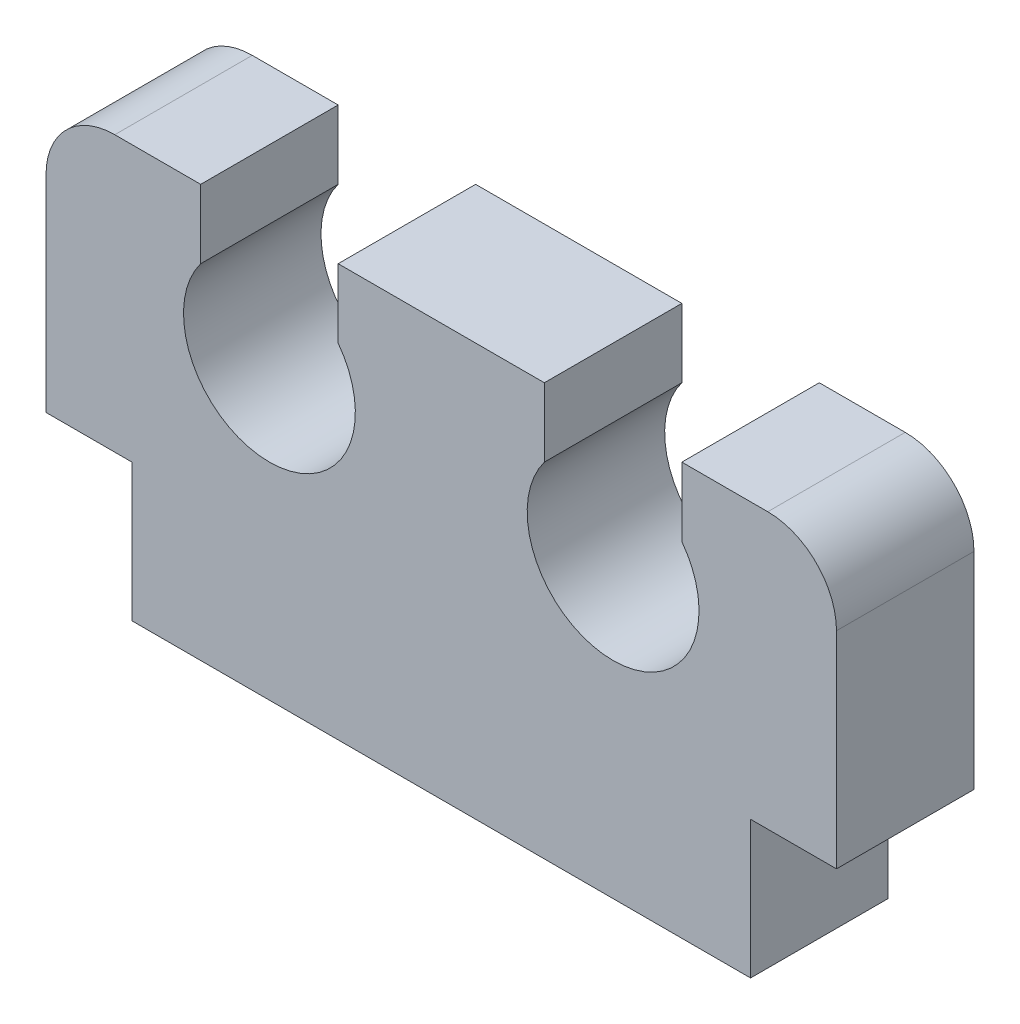
ISO-10303-21;
HEADER;
FILE_DESCRIPTION(('STEP AP214'),'2;1');
FILE_NAME('part.step','',(''),(''),'','','');
FILE_SCHEMA(('AUTOMOTIVE_DESIGN { 1 0 10303 214 1 1 1 1 }'));
ENDSEC;
DATA;
#1=APPLICATION_CONTEXT('core data for automotive mechanical design processes');
#2=APPLICATION_PROTOCOL_DEFINITION('international standard','automotive_design',2000,#1);
#3=PRODUCT_CONTEXT('',#1,'mechanical');
#4=PRODUCT('Part','Part','',(#3));
#5=PRODUCT_RELATED_PRODUCT_CATEGORY('part','',(#4));
#6=PRODUCT_DEFINITION_FORMATION('','',#4);
#7=PRODUCT_DEFINITION_CONTEXT('part definition',#1,'design');
#8=PRODUCT_DEFINITION('design','',#6,#7);
#9=PRODUCT_DEFINITION_SHAPE('','',#8);
#10=(LENGTH_UNIT() NAMED_UNIT(*) SI_UNIT(.MILLI.,.METRE.));
#11=(NAMED_UNIT(*) PLANE_ANGLE_UNIT() SI_UNIT($,.RADIAN.));
#12=(NAMED_UNIT(*) SI_UNIT($,.STERADIAN.) SOLID_ANGLE_UNIT());
#13=UNCERTAINTY_MEASURE_WITH_UNIT(LENGTH_MEASURE(1.E-05),#10,'distance_accuracy_value','');
#14=(GEOMETRIC_REPRESENTATION_CONTEXT(3) GLOBAL_UNCERTAINTY_ASSIGNED_CONTEXT((#13)) GLOBAL_UNIT_ASSIGNED_CONTEXT((#10,
#11,#12)) REPRESENTATION_CONTEXT('',''));
#15=CARTESIAN_POINT('',(0.,0.,0.));
#16=DIRECTION('',(0.,0.,1.));
#17=DIRECTION('',(1.,0.,0.));
#18=AXIS2_PLACEMENT_3D('',#15,#16,#17);
#19=CARTESIAN_POINT('',(1972.60984128656,1159.14364122188,2.));
#20=DIRECTION('',(0.,0.,-1.));
#21=DIRECTION('',(-1.,0.,0.));
#22=AXIS2_PLACEMENT_3D('',#19,#20,#21);
#23=CYLINDRICAL_SURFACE('',#22,1.24999999999988);
#24=CARTESIAN_POINT('',(1972.60984128656,1159.14364122188,0.));
#25=DIRECTION('',(0.,0.,-1.));
#26=DIRECTION('',(1.,0.,0.));
#27=AXIS2_PLACEMENT_3D('',#24,#25,#26);
#28=CIRCLE('',#27,1.24999999999988);
#29=CARTESIAN_POINT('',(1973.60984128656,1159.89364122188,0.));
#30=VERTEX_POINT('',#29);
#31=CARTESIAN_POINT('',(1971.60984128656,1159.89364122188,0.));
#32=VERTEX_POINT('',#31);
#33=EDGE_CURVE('E190',#30,#32,#28,.T.);
#34=ORIENTED_EDGE('',*,*,#33,.T.);
#35=DIRECTION('',(0.,0.,-1.));
#36=VECTOR('',#35,1.);
#37=CARTESIAN_POINT('',(1971.60984128656,1159.89364122188,2.));
#38=LINE('',#37,#36);
#39=CARTESIAN_POINT('',(1971.60984128656,1159.89364122188,2.));
#40=VERTEX_POINT('',#39);
#41=EDGE_CURVE('E11',#40,#32,#38,.T.);
#42=ORIENTED_EDGE('',*,*,#41,.F.);
#43=CARTESIAN_POINT('',(1972.60984128656,1159.14364122188,2.));
#44=DIRECTION('',(0.,0.,-1.));
#45=DIRECTION('',(1.,0.,0.));
#46=AXIS2_PLACEMENT_3D('',#43,#44,#45);
#47=CIRCLE('',#46,1.24999999999988);
#48=CARTESIAN_POINT('',(1973.60984128656,1159.89364122188,2.));
#49=VERTEX_POINT('',#48);
#50=EDGE_CURVE('E224',#49,#40,#47,.T.);
#51=ORIENTED_EDGE('',*,*,#50,.F.);
#52=DIRECTION('',(0.,0.,-1.));
#53=VECTOR('',#52,1.);
#54=CARTESIAN_POINT('',(1973.60984128656,1159.89364122188,2.));
#55=LINE('',#54,#53);
#56=EDGE_CURVE('E186',#49,#30,#55,.T.);
#57=ORIENTED_EDGE('',*,*,#56,.T.);
#58=EDGE_LOOP('',(#34,#42,#51,#57));
#59=FACE_BOUND('',#58,.T.);
#60=ADVANCED_FACE('F34',(#59),#23,.F.);
#61=CARTESIAN_POINT('',(1971.60984128656,1160.89364122188,2.));
#62=DIRECTION('',(-1.,2.22044604924908E-13,0.));
#63=DIRECTION('',(-2.22044604924908E-13,-1.,0.));
#64=AXIS2_PLACEMENT_3D('',#61,#62,#63);
#65=PLANE('',#64);
#66=DIRECTION('',(2.22044604924908E-13,1.,0.));
#67=VECTOR('',#66,1.);
#68=CARTESIAN_POINT('',(1971.60984128656,1160.89364122188,0.));
#69=LINE('',#68,#67);
#70=CARTESIAN_POINT('',(1971.60984128656,1160.89364122188,0.));
#71=VERTEX_POINT('',#70);
#72=EDGE_CURVE('E193',#32,#71,#69,.T.);
#73=ORIENTED_EDGE('',*,*,#72,.T.);
#74=DIRECTION('',(0.,0.,-1.));
#75=VECTOR('',#74,1.);
#76=CARTESIAN_POINT('',(1971.60984128656,1160.89364122188,2.));
#77=LINE('',#76,#75);
#78=CARTESIAN_POINT('',(1971.60984128656,1160.89364122188,2.));
#79=VERTEX_POINT('',#78);
#80=EDGE_CURVE('E42',#79,#71,#77,.T.);
#81=ORIENTED_EDGE('',*,*,#80,.F.);
#82=DIRECTION('',(2.22044604924908E-13,1.,0.));
#83=VECTOR('',#82,1.);
#84=CARTESIAN_POINT('',(1971.60984128656,1160.89364122188,2.));
#85=LINE('',#84,#83);
#86=EDGE_CURVE('E123',#40,#79,#85,.T.);
#87=ORIENTED_EDGE('',*,*,#86,.F.);
#88=ORIENTED_EDGE('',*,*,#41,.T.);
#89=EDGE_LOOP('',(#73,#81,#87,#88));
#90=FACE_BOUND('',#89,.T.);
#91=ADVANCED_FACE('F332',(#90),#65,.F.);
#92=CARTESIAN_POINT('',(1971.60984128656,1160.89364122188,2.));
#93=DIRECTION('',(-8.88178419700933E-13,-1.,0.));
#94=DIRECTION('',(1.,-8.88178419700933E-13,0.));
#95=AXIS2_PLACEMENT_3D('',#92,#93,#94);
#96=PLANE('',#95);
#97=DIRECTION('',(-1.,8.88178419700933E-13,0.));
#98=VECTOR('',#97,1.);
#99=CARTESIAN_POINT('',(1971.60984128656,1160.89364122188,0.));
#100=LINE('',#99,#98);
#101=CARTESIAN_POINT('',(1970.35984128656,1160.89364122188,0.));
#102=VERTEX_POINT('',#101);
#103=EDGE_CURVE('E195',#71,#102,#100,.T.);
#104=ORIENTED_EDGE('',*,*,#103,.T.);
#105=DIRECTION('',(0.,0.,-1.));
#106=VECTOR('',#105,1.);
#107=CARTESIAN_POINT('',(1970.35984128656,1160.89364122188,2.));
#108=LINE('',#107,#106);
#109=CARTESIAN_POINT('',(1970.35984128656,1160.89364122188,2.));
#110=VERTEX_POINT('',#109);
#111=EDGE_CURVE('E261',#110,#102,#108,.T.);
#112=ORIENTED_EDGE('',*,*,#111,.F.);
#113=DIRECTION('',(-1.,8.88178419700933E-13,0.));
#114=VECTOR('',#113,1.);
#115=CARTESIAN_POINT('',(1971.60984128656,1160.89364122188,2.));
#116=LINE('',#115,#114);
#117=EDGE_CURVE('E269',#79,#110,#116,.T.);
#118=ORIENTED_EDGE('',*,*,#117,.F.);
#119=ORIENTED_EDGE('',*,*,#80,.T.);
#120=EDGE_LOOP('',(#104,#112,#118,#119));
#121=FACE_BOUND('',#120,.T.);
#122=ADVANCED_FACE('F267',(#121),#96,.F.);
#123=CARTESIAN_POINT('',(1970.35984128656,1159.89364122188,2.));
#124=DIRECTION('',(0.,0.,-1.));
#125=DIRECTION('',(-1.,0.,0.));
#126=AXIS2_PLACEMENT_3D('',#123,#124,#125);
#127=CYLINDRICAL_SURFACE('',#126,0.99999999999989);
#128=CARTESIAN_POINT('',(1970.35984128656,1159.89364122188,0.));
#129=DIRECTION('',(0.,0.,1.));
#130=DIRECTION('',(1.,0.,0.));
#131=AXIS2_PLACEMENT_3D('',#128,#129,#130);
#132=CIRCLE('',#131,0.99999999999989);
#133=CARTESIAN_POINT('',(1969.35984128656,1159.89364122188,0.));
#134=VERTEX_POINT('',#133);
#135=EDGE_CURVE('E197',#102,#134,#132,.T.);
#136=ORIENTED_EDGE('',*,*,#135,.T.);
#137=DIRECTION('',(0.,0.,-1.));
#138=VECTOR('',#137,1.);
#139=CARTESIAN_POINT('',(1969.35984128656,1159.89364122188,2.));
#140=LINE('',#139,#138);
#141=CARTESIAN_POINT('',(1969.35984128656,1159.89364122188,2.));
#142=VERTEX_POINT('',#141);
#143=EDGE_CURVE('E258',#142,#134,#140,.T.);
#144=ORIENTED_EDGE('',*,*,#143,.F.);
#145=CARTESIAN_POINT('',(1970.35984128656,1159.89364122188,2.));
#146=DIRECTION('',(0.,0.,1.));
#147=DIRECTION('',(1.,0.,0.));
#148=AXIS2_PLACEMENT_3D('',#145,#146,#147);
#149=CIRCLE('',#148,0.99999999999989);
#150=EDGE_CURVE('E287',#110,#142,#149,.T.);
#151=ORIENTED_EDGE('',*,*,#150,.F.);
#152=ORIENTED_EDGE('',*,*,#111,.T.);
#153=EDGE_LOOP('',(#136,#144,#151,#152));
#154=FACE_BOUND('',#153,.T.);
#155=ADVANCED_FACE('F278',(#154),#127,.T.);
#156=CARTESIAN_POINT('',(1969.35984128656,1156.89364122188,2.));
#157=DIRECTION('',(1.,0.,0.));
#158=DIRECTION('',(0.,0.,-1.));
#159=AXIS2_PLACEMENT_3D('',#156,#157,#158);
#160=PLANE('',#159);
#161=DIRECTION('',(0.,-1.,0.));
#162=VECTOR('',#161,1.);
#163=CARTESIAN_POINT('',(1969.35984128656,1156.89364122188,0.));
#164=LINE('',#163,#162);
#165=CARTESIAN_POINT('',(1969.35984128656,1156.89364122188,0.));
#166=VERTEX_POINT('',#165);
#167=EDGE_CURVE('E199',#134,#166,#164,.T.);
#168=ORIENTED_EDGE('',*,*,#167,.T.);
#169=DIRECTION('',(0.,0.,-1.));
#170=VECTOR('',#169,1.);
#171=CARTESIAN_POINT('',(1969.35984128656,1156.89364122188,2.));
#172=LINE('',#171,#170);
#173=CARTESIAN_POINT('',(1969.35984128656,1156.89364122188,2.));
#174=VERTEX_POINT('',#173);
#175=EDGE_CURVE('E255',#174,#166,#172,.T.);
#176=ORIENTED_EDGE('',*,*,#175,.F.);
#177=DIRECTION('',(0.,-1.,0.));
#178=VECTOR('',#177,1.);
#179=CARTESIAN_POINT('',(1969.35984128656,1156.89364122188,2.));
#180=LINE('',#179,#178);
#181=EDGE_CURVE('E284',#142,#174,#180,.T.);
#182=ORIENTED_EDGE('',*,*,#181,.F.);
#183=ORIENTED_EDGE('',*,*,#143,.T.);
#184=EDGE_LOOP('',(#168,#176,#182,#183));
#185=FACE_BOUND('',#184,.T.);
#186=ADVANCED_FACE('F282',(#185),#160,.F.);
#187=CARTESIAN_POINT('',(1970.60984128656,1156.89364122188,2.));
#188=DIRECTION('',(0.,1.,0.));
#189=DIRECTION('',(0.,0.,1.));
#190=AXIS2_PLACEMENT_3D('',#187,#188,#189);
#191=PLANE('',#190);
#192=DIRECTION('',(1.,0.,0.));
#193=VECTOR('',#192,1.);
#194=CARTESIAN_POINT('',(1970.60984128656,1156.89364122188,0.));
#195=LINE('',#194,#193);
#196=CARTESIAN_POINT('',(1970.60984128656,1156.89364122188,0.));
#197=VERTEX_POINT('',#196);
#198=EDGE_CURVE('E201',#166,#197,#195,.T.);
#199=ORIENTED_EDGE('',*,*,#198,.T.);
#200=DIRECTION('',(0.,0.,-1.));
#201=VECTOR('',#200,1.);
#202=CARTESIAN_POINT('',(1970.60984128656,1156.89364122188,2.));
#203=LINE('',#202,#201);
#204=CARTESIAN_POINT('',(1970.60984128656,1156.89364122188,2.));
#205=VERTEX_POINT('',#204);
#206=EDGE_CURVE('E252',#205,#197,#203,.T.);
#207=ORIENTED_EDGE('',*,*,#206,.F.);
#208=DIRECTION('',(1.,0.,0.));
#209=VECTOR('',#208,1.);
#210=CARTESIAN_POINT('',(1970.60984128656,1156.89364122188,2.));
#211=LINE('',#210,#209);
#212=EDGE_CURVE('E286',#174,#205,#211,.T.);
#213=ORIENTED_EDGE('',*,*,#212,.F.);
#214=ORIENTED_EDGE('',*,*,#175,.T.);
#215=EDGE_LOOP('',(#199,#207,#213,#214));
#216=FACE_BOUND('',#215,.T.);
#217=ADVANCED_FACE('F345',(#216),#191,.F.);
#218=CARTESIAN_POINT('',(1970.60984128656,1156.89364122188,2.));
#219=DIRECTION('',(1.,-1.11022302462528E-13,0.));
#220=DIRECTION('',(1.11022302462528E-13,1.,0.));
#221=AXIS2_PLACEMENT_3D('',#218,#219,#220);
#222=PLANE('',#221);
#223=DIRECTION('',(-1.11022302462528E-13,-1.,0.));
#224=VECTOR('',#223,1.);
#225=CARTESIAN_POINT('',(1970.60984128656,1156.89364122188,0.));
#226=LINE('',#225,#224);
#227=CARTESIAN_POINT('',(1970.60984128656,1154.89364122188,0.));
#228=VERTEX_POINT('',#227);
#229=EDGE_CURVE('E203',#197,#228,#226,.T.);
#230=ORIENTED_EDGE('',*,*,#229,.T.);
#231=DIRECTION('',(0.,0.,-1.));
#232=VECTOR('',#231,1.);
#233=CARTESIAN_POINT('',(1970.60984128656,1154.89364122188,2.));
#234=LINE('',#233,#232);
#235=CARTESIAN_POINT('',(1970.60984128656,1154.89364122188,2.));
#236=VERTEX_POINT('',#235);
#237=EDGE_CURVE('E249',#236,#228,#234,.T.);
#238=ORIENTED_EDGE('',*,*,#237,.F.);
#239=DIRECTION('',(-1.11022302462528E-13,-1.,0.));
#240=VECTOR('',#239,1.);
#241=CARTESIAN_POINT('',(1970.60984128656,1156.89364122188,2.));
#242=LINE('',#241,#240);
#243=EDGE_CURVE('E289',#205,#236,#242,.T.);
#244=ORIENTED_EDGE('',*,*,#243,.F.);
#245=ORIENTED_EDGE('',*,*,#206,.T.);
#246=EDGE_LOOP('',(#230,#238,#244,#245));
#247=FACE_BOUND('',#246,.T.);
#248=ADVANCED_FACE('F348',(#247),#222,.F.);
#249=CARTESIAN_POINT('',(1970.60984128656,1154.89364122188,2.));
#250=DIRECTION('',(0.,1.,0.));
#251=DIRECTION('',(0.,0.,1.));
#252=AXIS2_PLACEMENT_3D('',#249,#250,#251);
#253=PLANE('',#252);
#254=DIRECTION('',(1.,0.,0.));
#255=VECTOR('',#254,1.);
#256=CARTESIAN_POINT('',(1970.60984128656,1154.89364122188,0.));
#257=LINE('',#256,#255);
#258=CARTESIAN_POINT('',(1979.60984128656,1154.89364122188,0.));
#259=VERTEX_POINT('',#258);
#260=EDGE_CURVE('E205',#228,#259,#257,.T.);
#261=ORIENTED_EDGE('',*,*,#260,.T.);
#262=DIRECTION('',(0.,0.,-1.));
#263=VECTOR('',#262,1.);
#264=CARTESIAN_POINT('',(1979.60984128656,1154.89364122188,2.));
#265=LINE('',#264,#263);
#266=CARTESIAN_POINT('',(1979.60984128656,1154.89364122188,2.));
#267=VERTEX_POINT('',#266);
#268=EDGE_CURVE('E246',#267,#259,#265,.T.);
#269=ORIENTED_EDGE('',*,*,#268,.F.);
#270=DIRECTION('',(1.,0.,0.));
#271=VECTOR('',#270,1.);
#272=CARTESIAN_POINT('',(1970.60984128656,1154.89364122188,2.));
#273=LINE('',#272,#271);
#274=EDGE_CURVE('E295',#236,#267,#273,.T.);
#275=ORIENTED_EDGE('',*,*,#274,.F.);
#276=ORIENTED_EDGE('',*,*,#237,.T.);
#277=EDGE_LOOP('',(#261,#269,#275,#276));
#278=FACE_BOUND('',#277,.T.);
#279=ADVANCED_FACE('F352',(#278),#253,.F.);
#280=CARTESIAN_POINT('',(1979.60984128656,1156.89364122188,2.));
#281=DIRECTION('',(-1.,0.,0.));
#282=DIRECTION('',(0.,0.,1.));
#283=AXIS2_PLACEMENT_3D('',#280,#281,#282);
#284=PLANE('',#283);
#285=DIRECTION('',(0.,1.,0.));
#286=VECTOR('',#285,1.);
#287=CARTESIAN_POINT('',(1979.60984128656,1156.89364122188,0.));
#288=LINE('',#287,#286);
#289=CARTESIAN_POINT('',(1979.60984128656,1156.89364122188,0.));
#290=VERTEX_POINT('',#289);
#291=EDGE_CURVE('E207',#259,#290,#288,.T.);
#292=ORIENTED_EDGE('',*,*,#291,.T.);
#293=DIRECTION('',(0.,0.,-1.));
#294=VECTOR('',#293,1.);
#295=CARTESIAN_POINT('',(1979.60984128656,1156.89364122188,2.));
#296=LINE('',#295,#294);
#297=CARTESIAN_POINT('',(1979.60984128656,1156.89364122188,2.));
#298=VERTEX_POINT('',#297);
#299=EDGE_CURVE('E243',#298,#290,#296,.T.);
#300=ORIENTED_EDGE('',*,*,#299,.F.);
#301=DIRECTION('',(0.,1.,0.));
#302=VECTOR('',#301,1.);
#303=CARTESIAN_POINT('',(1979.60984128656,1156.89364122188,2.));
#304=LINE('',#303,#302);
#305=EDGE_CURVE('E297',#267,#298,#304,.T.);
#306=ORIENTED_EDGE('',*,*,#305,.F.);
#307=ORIENTED_EDGE('',*,*,#268,.T.);
#308=EDGE_LOOP('',(#292,#300,#306,#307));
#309=FACE_BOUND('',#308,.T.);
#310=ADVANCED_FACE('F356',(#309),#284,.F.);
#311=CARTESIAN_POINT('',(1979.60984128656,1156.89364122188,2.));
#312=DIRECTION('',(0.,1.,0.));
#313=DIRECTION('',(0.,0.,1.));
#314=AXIS2_PLACEMENT_3D('',#311,#312,#313);
#315=PLANE('',#314);
#316=DIRECTION('',(1.,0.,0.));
#317=VECTOR('',#316,1.);
#318=CARTESIAN_POINT('',(1979.60984128656,1156.89364122188,0.));
#319=LINE('',#318,#317);
#320=CARTESIAN_POINT('',(1980.85984128656,1156.89364122188,0.));
#321=VERTEX_POINT('',#320);
#322=EDGE_CURVE('E209',#290,#321,#319,.T.);
#323=ORIENTED_EDGE('',*,*,#322,.T.);
#324=DIRECTION('',(0.,0.,-1.));
#325=VECTOR('',#324,1.);
#326=CARTESIAN_POINT('',(1980.85984128656,1156.89364122188,2.));
#327=LINE('',#326,#325);
#328=CARTESIAN_POINT('',(1980.85984128656,1156.89364122188,2.));
#329=VERTEX_POINT('',#328);
#330=EDGE_CURVE('E240',#329,#321,#327,.T.);
#331=ORIENTED_EDGE('',*,*,#330,.F.);
#332=DIRECTION('',(1.,0.,0.));
#333=VECTOR('',#332,1.);
#334=CARTESIAN_POINT('',(1979.60984128656,1156.89364122188,2.));
#335=LINE('',#334,#333);
#336=EDGE_CURVE('E299',#298,#329,#335,.T.);
#337=ORIENTED_EDGE('',*,*,#336,.F.);
#338=ORIENTED_EDGE('',*,*,#299,.T.);
#339=EDGE_LOOP('',(#323,#331,#337,#338));
#340=FACE_BOUND('',#339,.T.);
#341=ADVANCED_FACE('F360',(#340),#315,.F.);
#342=CARTESIAN_POINT('',(1980.85984128656,1156.89364122188,2.));
#343=DIRECTION('',(-1.,0.,0.));
#344=DIRECTION('',(0.,0.,1.));
#345=AXIS2_PLACEMENT_3D('',#342,#343,#344);
#346=PLANE('',#345);
#347=DIRECTION('',(0.,1.,0.));
#348=VECTOR('',#347,1.);
#349=CARTESIAN_POINT('',(1980.85984128656,1156.89364122188,0.));
#350=LINE('',#349,#348);
#351=CARTESIAN_POINT('',(1980.85984128656,1159.89364122188,0.));
#352=VERTEX_POINT('',#351);
#353=EDGE_CURVE('E211',#321,#352,#350,.T.);
#354=ORIENTED_EDGE('',*,*,#353,.T.);
#355=DIRECTION('',(0.,0.,-1.));
#356=VECTOR('',#355,1.);
#357=CARTESIAN_POINT('',(1980.85984128656,1159.89364122188,2.));
#358=LINE('',#357,#356);
#359=CARTESIAN_POINT('',(1980.85984128656,1159.89364122188,2.));
#360=VERTEX_POINT('',#359);
#361=EDGE_CURVE('E237',#360,#352,#358,.T.);
#362=ORIENTED_EDGE('',*,*,#361,.F.);
#363=DIRECTION('',(0.,1.,0.));
#364=VECTOR('',#363,1.);
#365=CARTESIAN_POINT('',(1980.85984128656,1156.89364122188,2.));
#366=LINE('',#365,#364);
#367=EDGE_CURVE('E301',#329,#360,#366,.T.);
#368=ORIENTED_EDGE('',*,*,#367,.F.);
#369=ORIENTED_EDGE('',*,*,#330,.T.);
#370=EDGE_LOOP('',(#354,#362,#368,#369));
#371=FACE_BOUND('',#370,.T.);
#372=ADVANCED_FACE('F364',(#371),#346,.F.);
#373=CARTESIAN_POINT('',(1979.85984128656,1159.89364122188,2.));
#374=DIRECTION('',(0.,0.,-1.));
#375=DIRECTION('',(-1.,0.,0.));
#376=AXIS2_PLACEMENT_3D('',#373,#374,#375);
#377=CYLINDRICAL_SURFACE('',#376,0.999999999999779);
#378=CARTESIAN_POINT('',(1979.85984128656,1159.89364122188,0.));
#379=DIRECTION('',(0.,0.,1.));
#380=DIRECTION('',(1.,0.,0.));
#381=AXIS2_PLACEMENT_3D('',#378,#379,#380);
#382=CIRCLE('',#381,0.999999999999779);
#383=CARTESIAN_POINT('',(1979.85984128656,1160.89364122188,0.));
#384=VERTEX_POINT('',#383);
#385=EDGE_CURVE('E213',#352,#384,#382,.T.);
#386=ORIENTED_EDGE('',*,*,#385,.T.);
#387=DIRECTION('',(0.,0.,-1.));
#388=VECTOR('',#387,1.);
#389=CARTESIAN_POINT('',(1979.85984128656,1160.89364122188,2.));
#390=LINE('',#389,#388);
#391=CARTESIAN_POINT('',(1979.85984128656,1160.89364122188,2.));
#392=VERTEX_POINT('',#391);
#393=EDGE_CURVE('E234',#392,#384,#390,.T.);
#394=ORIENTED_EDGE('',*,*,#393,.F.);
#395=CARTESIAN_POINT('',(1979.85984128656,1159.89364122188,2.));
#396=DIRECTION('',(0.,0.,1.));
#397=DIRECTION('',(1.,0.,0.));
#398=AXIS2_PLACEMENT_3D('',#395,#396,#397);
#399=CIRCLE('',#398,0.999999999999779);
#400=EDGE_CURVE('E303',#360,#392,#399,.T.);
#401=ORIENTED_EDGE('',*,*,#400,.F.);
#402=ORIENTED_EDGE('',*,*,#361,.T.);
#403=EDGE_LOOP('',(#386,#394,#401,#402));
#404=FACE_BOUND('',#403,.T.);
#405=ADVANCED_FACE('F368',(#404),#377,.T.);
#406=CARTESIAN_POINT('',(1978.60984128656,1160.89364122188,2.));
#407=DIRECTION('',(1.77635683939997E-13,-1.,0.));
#408=DIRECTION('',(1.,1.77635683939997E-13,0.));
#409=AXIS2_PLACEMENT_3D('',#406,#407,#408);
#410=PLANE('',#409);
#411=DIRECTION('',(-1.,-1.77635683939997E-13,0.));
#412=VECTOR('',#411,1.);
#413=CARTESIAN_POINT('',(1978.60984128656,1160.89364122188,0.));
#414=LINE('',#413,#412);
#415=CARTESIAN_POINT('',(1978.60984128656,1160.89364122188,0.));
#416=VERTEX_POINT('',#415);
#417=EDGE_CURVE('E215',#384,#416,#414,.T.);
#418=ORIENTED_EDGE('',*,*,#417,.T.);
#419=DIRECTION('',(0.,0.,-1.));
#420=VECTOR('',#419,1.);
#421=CARTESIAN_POINT('',(1978.60984128656,1160.89364122188,2.));
#422=LINE('',#421,#420);
#423=CARTESIAN_POINT('',(1978.60984128656,1160.89364122188,2.));
#424=VERTEX_POINT('',#423);
#425=EDGE_CURVE('E231',#424,#416,#422,.T.);
#426=ORIENTED_EDGE('',*,*,#425,.F.);
#427=DIRECTION('',(-1.,-1.77635683939997E-13,0.));
#428=VECTOR('',#427,1.);
#429=CARTESIAN_POINT('',(1978.60984128656,1160.89364122188,2.));
#430=LINE('',#429,#428);
#431=EDGE_CURVE('E305',#392,#424,#430,.T.);
#432=ORIENTED_EDGE('',*,*,#431,.F.);
#433=ORIENTED_EDGE('',*,*,#393,.T.);
#434=EDGE_LOOP('',(#418,#426,#432,#433));
#435=FACE_BOUND('',#434,.T.);
#436=ADVANCED_FACE('F372',(#435),#410,.F.);
#437=CARTESIAN_POINT('',(1978.60984128656,1160.89364122188,2.));
#438=DIRECTION('',(1.,-2.22044604924957E-13,0.));
#439=DIRECTION('',(2.22044604924957E-13,1.,0.));
#440=AXIS2_PLACEMENT_3D('',#437,#438,#439);
#441=PLANE('',#440);
#442=DIRECTION('',(-2.22044604924957E-13,-1.,0.));
#443=VECTOR('',#442,1.);
#444=CARTESIAN_POINT('',(1978.60984128656,1160.89364122188,0.));
#445=LINE('',#444,#443);
#446=CARTESIAN_POINT('',(1978.60984128656,1159.89364122188,0.));
#447=VERTEX_POINT('',#446);
#448=EDGE_CURVE('E217',#416,#447,#445,.T.);
#449=ORIENTED_EDGE('',*,*,#448,.T.);
#450=DIRECTION('',(0.,0.,-1.));
#451=VECTOR('',#450,1.);
#452=CARTESIAN_POINT('',(1978.60984128656,1159.89364122188,2.));
#453=LINE('',#452,#451);
#454=CARTESIAN_POINT('',(1978.60984128656,1159.89364122188,2.));
#455=VERTEX_POINT('',#454);
#456=EDGE_CURVE('E228',#455,#447,#453,.T.);
#457=ORIENTED_EDGE('',*,*,#456,.F.);
#458=DIRECTION('',(-2.22044604924957E-13,-1.,0.));
#459=VECTOR('',#458,1.);
#460=CARTESIAN_POINT('',(1978.60984128656,1160.89364122188,2.));
#461=LINE('',#460,#459);
#462=EDGE_CURVE('E307',#424,#455,#461,.T.);
#463=ORIENTED_EDGE('',*,*,#462,.F.);
#464=ORIENTED_EDGE('',*,*,#425,.T.);
#465=EDGE_LOOP('',(#449,#457,#463,#464));
#466=FACE_BOUND('',#465,.T.);
#467=ADVANCED_FACE('F313',(#466),#441,.F.);
#468=CARTESIAN_POINT('',(1977.60984128656,1159.14364122188,2.));
#469=DIRECTION('',(0.,0.,-1.));
#470=DIRECTION('',(-1.,0.,0.));
#471=AXIS2_PLACEMENT_3D('',#468,#469,#470);
#472=CYLINDRICAL_SURFACE('',#471,1.25000000000015);
#473=CARTESIAN_POINT('',(1977.60984128656,1159.14364122188,0.));
#474=DIRECTION('',(0.,0.,-1.));
#475=DIRECTION('',(1.,0.,0.));
#476=AXIS2_PLACEMENT_3D('',#473,#474,#475);
#477=CIRCLE('',#476,1.25000000000015);
#478=CARTESIAN_POINT('',(1976.60984128656,1159.89364122188,0.));
#479=VERTEX_POINT('',#478);
#480=EDGE_CURVE('E219',#447,#479,#477,.T.);
#481=ORIENTED_EDGE('',*,*,#480,.T.);
#482=DIRECTION('',(0.,0.,-1.));
#483=VECTOR('',#482,1.);
#484=CARTESIAN_POINT('',(1976.60984128656,1159.89364122188,2.));
#485=LINE('',#484,#483);
#486=CARTESIAN_POINT('',(1976.60984128656,1159.89364122188,2.));
#487=VERTEX_POINT('',#486);
#488=EDGE_CURVE('E181',#487,#479,#485,.T.);
#489=ORIENTED_EDGE('',*,*,#488,.F.);
#490=CARTESIAN_POINT('',(1977.60984128656,1159.14364122188,2.));
#491=DIRECTION('',(0.,0.,-1.));
#492=DIRECTION('',(1.,0.,0.));
#493=AXIS2_PLACEMENT_3D('',#490,#491,#492);
#494=CIRCLE('',#493,1.25000000000015);
#495=EDGE_CURVE('E172',#455,#487,#494,.T.);
#496=ORIENTED_EDGE('',*,*,#495,.F.);
#497=ORIENTED_EDGE('',*,*,#456,.T.);
#498=EDGE_LOOP('',(#481,#489,#496,#497));
#499=FACE_BOUND('',#498,.T.);
#500=ADVANCED_FACE('F317',(#499),#472,.F.);
#501=CARTESIAN_POINT('',(1976.60984128656,1160.89364122188,2.));
#502=DIRECTION('',(-1.,2.22044604924957E-13,0.));
#503=DIRECTION('',(-2.22044604924957E-13,-1.,0.));
#504=AXIS2_PLACEMENT_3D('',#501,#502,#503);
#505=PLANE('',#504);
#506=DIRECTION('',(2.22044604924957E-13,1.,0.));
#507=VECTOR('',#506,1.);
#508=CARTESIAN_POINT('',(1976.60984128656,1160.89364122188,0.));
#509=LINE('',#508,#507);
#510=CARTESIAN_POINT('',(1976.60984128656,1160.89364122188,0.));
#511=VERTEX_POINT('',#510);
#512=EDGE_CURVE('E180',#479,#511,#509,.T.);
#513=ORIENTED_EDGE('',*,*,#512,.T.);
#514=DIRECTION('',(0.,0.,-1.));
#515=VECTOR('',#514,1.);
#516=CARTESIAN_POINT('',(1976.60984128656,1160.89364122188,2.));
#517=LINE('',#516,#515);
#518=CARTESIAN_POINT('',(1976.60984128656,1160.89364122188,2.));
#519=VERTEX_POINT('',#518);
#520=EDGE_CURVE('E177',#519,#511,#517,.T.);
#521=ORIENTED_EDGE('',*,*,#520,.F.);
#522=DIRECTION('',(2.22044604924957E-13,1.,0.));
#523=VECTOR('',#522,1.);
#524=CARTESIAN_POINT('',(1976.60984128656,1160.89364122188,2.));
#525=LINE('',#524,#523);
#526=EDGE_CURVE('E166',#487,#519,#525,.T.);
#527=ORIENTED_EDGE('',*,*,#526,.F.);
#528=ORIENTED_EDGE('',*,*,#488,.T.);
#529=EDGE_LOOP('',(#513,#521,#527,#528));
#530=FACE_BOUND('',#529,.T.);
#531=ADVANCED_FACE('F178',(#530),#505,.F.);
#532=CARTESIAN_POINT('',(1973.60984128656,1160.89364122188,2.));
#533=DIRECTION('',(0.,-1.,0.));
#534=DIRECTION('',(0.,0.,-1.));
#535=AXIS2_PLACEMENT_3D('',#532,#533,#534);
#536=PLANE('',#535);
#537=DIRECTION('',(-1.,0.,0.));
#538=VECTOR('',#537,1.);
#539=CARTESIAN_POINT('',(1973.60984128656,1160.89364122188,0.));
#540=LINE('',#539,#538);
#541=CARTESIAN_POINT('',(1973.60984128656,1160.89364122188,0.));
#542=VERTEX_POINT('',#541);
#543=EDGE_CURVE('E109',#511,#542,#540,.T.);
#544=ORIENTED_EDGE('',*,*,#543,.T.);
#545=DIRECTION('',(0.,0.,-1.));
#546=VECTOR('',#545,1.);
#547=CARTESIAN_POINT('',(1973.60984128656,1160.89364122188,2.));
#548=LINE('',#547,#546);
#549=CARTESIAN_POINT('',(1973.60984128656,1160.89364122188,2.));
#550=VERTEX_POINT('',#549);
#551=EDGE_CURVE('E182',#550,#542,#548,.T.);
#552=ORIENTED_EDGE('',*,*,#551,.F.);
#553=DIRECTION('',(-1.,0.,0.));
#554=VECTOR('',#553,1.);
#555=CARTESIAN_POINT('',(1973.60984128656,1160.89364122188,2.));
#556=LINE('',#555,#554);
#557=EDGE_CURVE('E170',#519,#550,#556,.T.);
#558=ORIENTED_EDGE('',*,*,#557,.F.);
#559=ORIENTED_EDGE('',*,*,#520,.T.);
#560=EDGE_LOOP('',(#544,#552,#558,#559));
#561=FACE_BOUND('',#560,.T.);
#562=ADVANCED_FACE('F184',(#561),#536,.F.);
#563=CARTESIAN_POINT('',(1973.60984128656,1160.89364122188,2.));
#564=DIRECTION('',(1.,-2.22044604925056E-13,0.));
#565=DIRECTION('',(2.22044604925056E-13,1.,0.));
#566=AXIS2_PLACEMENT_3D('',#563,#564,#565);
#567=PLANE('',#566);
#568=DIRECTION('',(-2.22044604925056E-13,-1.,0.));
#569=VECTOR('',#568,1.);
#570=CARTESIAN_POINT('',(1973.60984128656,1160.89364122188,0.));
#571=LINE('',#570,#569);
#572=EDGE_CURVE('E115',#542,#30,#571,.T.);
#573=ORIENTED_EDGE('',*,*,#572,.T.);
#574=ORIENTED_EDGE('',*,*,#56,.F.);
#575=DIRECTION('',(-2.22044604925056E-13,-1.,0.));
#576=VECTOR('',#575,1.);
#577=CARTESIAN_POINT('',(1973.60984128656,1160.89364122188,2.));
#578=LINE('',#577,#576);
#579=EDGE_CURVE('E50',#550,#49,#578,.T.);
#580=ORIENTED_EDGE('',*,*,#579,.F.);
#581=ORIENTED_EDGE('',*,*,#551,.T.);
#582=EDGE_LOOP('',(#573,#574,#580,#581));
#583=FACE_BOUND('',#582,.T.);
#584=ADVANCED_FACE('F321',(#583),#567,.F.);
#585=CARTESIAN_POINT('',(1972.60984128656,1159.14364122188,2.));
#586=DIRECTION('',(0.,0.,1.));
#587=DIRECTION('',(1.,0.,0.));
#588=AXIS2_PLACEMENT_3D('',#585,#586,#587);
#589=PLANE('',#588);
#590=ORIENTED_EDGE('',*,*,#50,.T.);
#591=ORIENTED_EDGE('',*,*,#86,.T.);
#592=ORIENTED_EDGE('',*,*,#117,.T.);
#593=ORIENTED_EDGE('',*,*,#150,.T.);
#594=ORIENTED_EDGE('',*,*,#181,.T.);
#595=ORIENTED_EDGE('',*,*,#212,.T.);
#596=ORIENTED_EDGE('',*,*,#243,.T.);
#597=ORIENTED_EDGE('',*,*,#274,.T.);
#598=ORIENTED_EDGE('',*,*,#305,.T.);
#599=ORIENTED_EDGE('',*,*,#336,.T.);
#600=ORIENTED_EDGE('',*,*,#367,.T.);
#601=ORIENTED_EDGE('',*,*,#400,.T.);
#602=ORIENTED_EDGE('',*,*,#431,.T.);
#603=ORIENTED_EDGE('',*,*,#462,.T.);
#604=ORIENTED_EDGE('',*,*,#495,.T.);
#605=ORIENTED_EDGE('',*,*,#526,.T.);
#606=ORIENTED_EDGE('',*,*,#557,.T.);
#607=ORIENTED_EDGE('',*,*,#579,.T.);
#608=EDGE_LOOP('',(#590,#591,#592,#593,#594,#595,#596,#597,#598,#599,#600,#601,#602,#603,#604,
#605,#606,#607));
#609=FACE_BOUND('',#608,.T.);
#610=ADVANCED_FACE('F168',(#609),#589,.T.);
#611=CARTESIAN_POINT('',(1972.60984128656,1159.14364122188,0.));
#612=DIRECTION('',(0.,0.,1.));
#613=DIRECTION('',(1.,0.,0.));
#614=AXIS2_PLACEMENT_3D('',#611,#612,#613);
#615=PLANE('',#614);
#616=ORIENTED_EDGE('',*,*,#33,.F.);
#617=ORIENTED_EDGE('',*,*,#572,.F.);
#618=ORIENTED_EDGE('',*,*,#543,.F.);
#619=ORIENTED_EDGE('',*,*,#512,.F.);
#620=ORIENTED_EDGE('',*,*,#480,.F.);
#621=ORIENTED_EDGE('',*,*,#448,.F.);
#622=ORIENTED_EDGE('',*,*,#417,.F.);
#623=ORIENTED_EDGE('',*,*,#385,.F.);
#624=ORIENTED_EDGE('',*,*,#353,.F.);
#625=ORIENTED_EDGE('',*,*,#322,.F.);
#626=ORIENTED_EDGE('',*,*,#291,.F.);
#627=ORIENTED_EDGE('',*,*,#260,.F.);
#628=ORIENTED_EDGE('',*,*,#229,.F.);
#629=ORIENTED_EDGE('',*,*,#198,.F.);
#630=ORIENTED_EDGE('',*,*,#167,.F.);
#631=ORIENTED_EDGE('',*,*,#135,.F.);
#632=ORIENTED_EDGE('',*,*,#103,.F.);
#633=ORIENTED_EDGE('',*,*,#72,.F.);
#634=EDGE_LOOP('',(#616,#617,#618,#619,#620,#621,#622,#623,#624,#625,#626,#627,#628,#629,#630,
#631,#632,#633));
#635=FACE_BOUND('',#634,.T.);
#636=ADVANCED_FACE('F273',(#635),#615,.F.);
#637=CLOSED_SHELL('',(#60,#91,#122,#155,#186,#217,#248,#279,#310,#341,#372,#405,#436,#467,#500,
#531,#562,#584,#610,#636));
#638=MANIFOLD_SOLID_BREP('B2',#637);
#639=ADVANCED_BREP_SHAPE_REPRESENTATION('',(#18,#638),#14);
#640=SHAPE_DEFINITION_REPRESENTATION(#9,#639);
ENDSEC;
END-ISO-10303-21;
